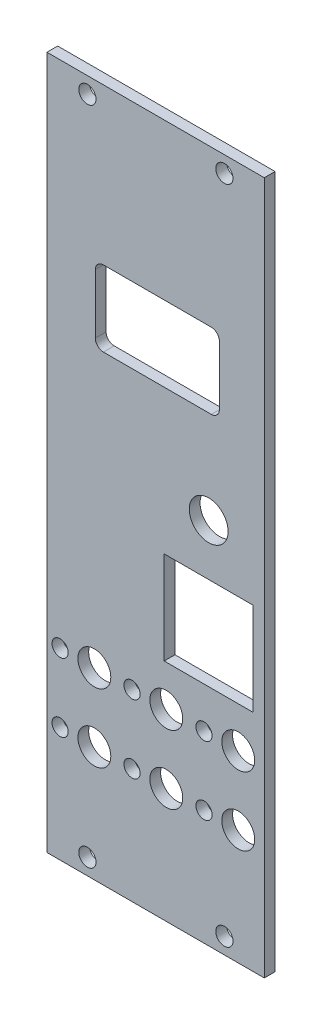
ISO-10303-21;
HEADER;
FILE_DESCRIPTION(('STEP AP214'),'2;1');
FILE_NAME('part.step','',(''),(''),'','','');
FILE_SCHEMA(('AUTOMOTIVE_DESIGN { 1 0 10303 214 1 1 1 1 }'));
ENDSEC;
DATA;
#1=APPLICATION_CONTEXT('core data for automotive mechanical design processes');
#2=APPLICATION_PROTOCOL_DEFINITION('international standard','automotive_design',2000,#1);
#3=PRODUCT_CONTEXT('',#1,'mechanical');
#4=PRODUCT('Part','Part','',(#3));
#5=PRODUCT_RELATED_PRODUCT_CATEGORY('part','',(#4));
#6=PRODUCT_DEFINITION_FORMATION('','',#4);
#7=PRODUCT_DEFINITION_CONTEXT('part definition',#1,'design');
#8=PRODUCT_DEFINITION('design','',#6,#7);
#9=PRODUCT_DEFINITION_SHAPE('','',#8);
#10=(LENGTH_UNIT() NAMED_UNIT(*) SI_UNIT(.MILLI.,.METRE.));
#11=(NAMED_UNIT(*) PLANE_ANGLE_UNIT() SI_UNIT($,.RADIAN.));
#12=(NAMED_UNIT(*) SI_UNIT($,.STERADIAN.) SOLID_ANGLE_UNIT());
#13=UNCERTAINTY_MEASURE_WITH_UNIT(LENGTH_MEASURE(1.E-05),#10,'distance_accuracy_value','');
#14=(GEOMETRIC_REPRESENTATION_CONTEXT(3) GLOBAL_UNCERTAINTY_ASSIGNED_CONTEXT((#13)) GLOBAL_UNIT_ASSIGNED_CONTEXT((#10,
#11,#12)) REPRESENTATION_CONTEXT('',''));
#15=CARTESIAN_POINT('',(0.,0.,0.));
#16=DIRECTION('',(0.,0.,1.));
#17=DIRECTION('',(1.,0.,0.));
#18=AXIS2_PLACEMENT_3D('',#15,#16,#17);
#19=CARTESIAN_POINT('',(0.,0.,2.));
#20=DIRECTION('',(0.,0.,-1.));
#21=DIRECTION('',(-1.,0.,0.));
#22=AXIS2_PLACEMENT_3D('',#19,#20,#21);
#23=PLANE('',#22);
#24=DIRECTION('',(0.,-1.,0.));
#25=VECTOR('',#24,1.);
#26=CARTESIAN_POINT('',(21.74,58.82,2.));
#27=LINE('',#26,#25);
#28=CARTESIAN_POINT('',(21.74,58.82,2.));
#29=VERTEX_POINT('',#28);
#30=CARTESIAN_POINT('',(21.74,41.62,2.));
#31=VERTEX_POINT('',#30);
#32=EDGE_CURVE('E210',#29,#31,#27,.T.);
#33=ORIENTED_EDGE('',*,*,#32,.F.);
#34=DIRECTION('',(-1.,0.,0.));
#35=VECTOR('',#34,1.);
#36=CARTESIAN_POINT('',(21.74,58.82,2.));
#37=LINE('',#36,#35);
#38=CARTESIAN_POINT('',(38.24,58.82,2.));
#39=VERTEX_POINT('',#38);
#40=EDGE_CURVE('E218',#39,#29,#37,.T.);
#41=ORIENTED_EDGE('',*,*,#40,.F.);
#42=DIRECTION('',(0.,1.,0.));
#43=VECTOR('',#42,1.);
#44=CARTESIAN_POINT('',(38.24,58.82,2.));
#45=LINE('',#44,#43);
#46=CARTESIAN_POINT('',(38.24,41.62,2.));
#47=VERTEX_POINT('',#46);
#48=EDGE_CURVE('E215',#47,#39,#45,.T.);
#49=ORIENTED_EDGE('',*,*,#48,.F.);
#50=DIRECTION('',(1.,0.,0.));
#51=VECTOR('',#50,1.);
#52=CARTESIAN_POINT('',(21.74,41.62,2.));
#53=LINE('',#52,#51);
#54=EDGE_CURVE('E212',#31,#47,#53,.T.);
#55=ORIENTED_EDGE('',*,*,#54,.F.);
#56=EDGE_LOOP('',(#33,#41,#49,#55));
#57=FACE_BOUND('',#56,.T.);
#58=DIRECTION('',(0.,-1.,0.));
#59=VECTOR('',#58,1.);
#60=CARTESIAN_POINT('',(0.,0.,2.));
#61=LINE('',#60,#59);
#62=CARTESIAN_POINT('',(0.,128.5,2.));
#63=VERTEX_POINT('',#62);
#64=CARTESIAN_POINT('',(0.,0.,2.));
#65=VERTEX_POINT('',#64);
#66=EDGE_CURVE('E343',#63,#65,#61,.T.);
#67=ORIENTED_EDGE('',*,*,#66,.T.);
#68=DIRECTION('',(1.,0.,0.));
#69=VECTOR('',#68,1.);
#70=CARTESIAN_POINT('',(0.,0.,2.));
#71=LINE('',#70,#69);
#72=CARTESIAN_POINT('',(40.3,0.,2.));
#73=VERTEX_POINT('',#72);
#74=EDGE_CURVE('E346',#65,#73,#71,.T.);
#75=ORIENTED_EDGE('',*,*,#74,.T.);
#76=DIRECTION('',(0.,1.,0.));
#77=VECTOR('',#76,1.);
#78=CARTESIAN_POINT('',(40.3,0.,2.));
#79=LINE('',#78,#77);
#80=CARTESIAN_POINT('',(40.3,128.5,2.));
#81=VERTEX_POINT('',#80);
#82=EDGE_CURVE('E349',#73,#81,#79,.T.);
#83=ORIENTED_EDGE('',*,*,#82,.T.);
#84=DIRECTION('',(-1.,0.,0.));
#85=VECTOR('',#84,1.);
#86=CARTESIAN_POINT('',(0.,128.5,2.));
#87=LINE('',#86,#85);
#88=EDGE_CURVE('E351',#81,#63,#87,.T.);
#89=ORIENTED_EDGE('',*,*,#88,.T.);
#90=EDGE_LOOP('',(#67,#75,#83,#89));
#91=FACE_BOUND('',#90,.T.);
#92=CARTESIAN_POINT('',(7.5,125.5,2.));
#93=DIRECTION('',(0.,0.,1.));
#94=DIRECTION('',(1.,0.,0.));
#95=AXIS2_PLACEMENT_3D('',#92,#93,#94);
#96=CIRCLE('',#95,1.59999999999999);
#97=CARTESIAN_POINT('',(9.09999999999999,125.5,2.));
#98=VERTEX_POINT('',#97);
#99=EDGE_CURVE('E337',#98,#98,#96,.T.);
#100=ORIENTED_EDGE('',*,*,#99,.F.);
#101=EDGE_LOOP('',(#100));
#102=FACE_BOUND('',#101,.T.);
#103=CARTESIAN_POINT('',(32.9,125.5,2.));
#104=DIRECTION('',(0.,0.,1.));
#105=DIRECTION('',(1.,0.,0.));
#106=AXIS2_PLACEMENT_3D('',#103,#104,#105);
#107=CIRCLE('',#106,1.6);
#108=CARTESIAN_POINT('',(34.5,125.5,2.));
#109=VERTEX_POINT('',#108);
#110=EDGE_CURVE('E331',#109,#109,#107,.T.);
#111=ORIENTED_EDGE('',*,*,#110,.F.);
#112=EDGE_LOOP('',(#111));
#113=FACE_BOUND('',#112,.T.);
#114=CARTESIAN_POINT('',(7.5,3.,2.));
#115=DIRECTION('',(0.,0.,1.));
#116=DIRECTION('',(1.,0.,0.));
#117=AXIS2_PLACEMENT_3D('',#114,#115,#116);
#118=CIRCLE('',#117,1.6);
#119=CARTESIAN_POINT('',(9.1,3.,2.));
#120=VERTEX_POINT('',#119);
#121=EDGE_CURVE('E325',#120,#120,#118,.T.);
#122=ORIENTED_EDGE('',*,*,#121,.F.);
#123=EDGE_LOOP('',(#122));
#124=FACE_BOUND('',#123,.T.);
#125=CARTESIAN_POINT('',(32.9,3.,2.));
#126=DIRECTION('',(0.,0.,1.));
#127=DIRECTION('',(1.,0.,0.));
#128=AXIS2_PLACEMENT_3D('',#125,#126,#127);
#129=CIRCLE('',#128,1.6);
#130=CARTESIAN_POINT('',(34.5,3.,2.));
#131=VERTEX_POINT('',#130);
#132=EDGE_CURVE('E319',#131,#131,#129,.T.);
#133=ORIENTED_EDGE('',*,*,#132,.F.);
#134=EDGE_LOOP('',(#133));
#135=FACE_BOUND('',#134,.T.);
#136=CARTESIAN_POINT('',(8.78999999999998,34.05,2.));
#137=DIRECTION('',(0.,0.,1.));
#138=DIRECTION('',(1.,0.,0.));
#139=AXIS2_PLACEMENT_3D('',#136,#137,#138);
#140=CIRCLE('',#139,3.05);
#141=CARTESIAN_POINT('',(11.84,34.05,2.));
#142=VERTEX_POINT('',#141);
#143=EDGE_CURVE('E313',#142,#142,#140,.T.);
#144=ORIENTED_EDGE('',*,*,#143,.F.);
#145=EDGE_LOOP('',(#144));
#146=FACE_BOUND('',#145,.T.);
#147=CARTESIAN_POINT('',(8.78999999999998,21.35,2.));
#148=DIRECTION('',(0.,0.,1.));
#149=DIRECTION('',(1.,0.,0.));
#150=AXIS2_PLACEMENT_3D('',#147,#148,#149);
#151=CIRCLE('',#150,3.05);
#152=CARTESIAN_POINT('',(11.84,21.35,2.));
#153=VERTEX_POINT('',#152);
#154=EDGE_CURVE('E307',#153,#153,#151,.T.);
#155=ORIENTED_EDGE('',*,*,#154,.F.);
#156=EDGE_LOOP('',(#155));
#157=FACE_BOUND('',#156,.T.);
#158=CARTESIAN_POINT('',(22.13,34.05,2.));
#159=DIRECTION('',(0.,0.,1.));
#160=DIRECTION('',(1.,0.,0.));
#161=AXIS2_PLACEMENT_3D('',#158,#159,#160);
#162=CIRCLE('',#161,3.05);
#163=CARTESIAN_POINT('',(25.18,34.05,2.));
#164=VERTEX_POINT('',#163);
#165=EDGE_CURVE('E301',#164,#164,#162,.T.);
#166=ORIENTED_EDGE('',*,*,#165,.F.);
#167=EDGE_LOOP('',(#166));
#168=FACE_BOUND('',#167,.T.);
#169=CARTESIAN_POINT('',(22.13,21.35,2.));
#170=DIRECTION('',(0.,0.,1.));
#171=DIRECTION('',(1.,0.,0.));
#172=AXIS2_PLACEMENT_3D('',#169,#170,#171);
#173=CIRCLE('',#172,3.05);
#174=CARTESIAN_POINT('',(25.18,21.35,2.));
#175=VERTEX_POINT('',#174);
#176=EDGE_CURVE('E295',#175,#175,#173,.T.);
#177=ORIENTED_EDGE('',*,*,#176,.F.);
#178=EDGE_LOOP('',(#177));
#179=FACE_BOUND('',#178,.T.);
#180=CARTESIAN_POINT('',(35.47,21.35,2.));
#181=DIRECTION('',(0.,0.,1.));
#182=DIRECTION('',(1.,0.,0.));
#183=AXIS2_PLACEMENT_3D('',#180,#181,#182);
#184=CIRCLE('',#183,3.05);
#185=CARTESIAN_POINT('',(38.52,21.35,2.));
#186=VERTEX_POINT('',#185);
#187=EDGE_CURVE('E289',#186,#186,#184,.T.);
#188=ORIENTED_EDGE('',*,*,#187,.F.);
#189=EDGE_LOOP('',(#188));
#190=FACE_BOUND('',#189,.T.);
#191=CARTESIAN_POINT('',(35.47,34.05,2.));
#192=DIRECTION('',(0.,0.,1.));
#193=DIRECTION('',(1.,0.,0.));
#194=AXIS2_PLACEMENT_3D('',#191,#192,#193);
#195=CIRCLE('',#194,3.05);
#196=CARTESIAN_POINT('',(38.52,34.05,2.));
#197=VERTEX_POINT('',#196);
#198=EDGE_CURVE('E283',#197,#197,#195,.T.);
#199=ORIENTED_EDGE('',*,*,#198,.F.);
#200=EDGE_LOOP('',(#199));
#201=FACE_BOUND('',#200,.T.);
#202=CARTESIAN_POINT('',(2.43999999999998,34.05,2.));
#203=DIRECTION('',(0.,0.,1.));
#204=DIRECTION('',(1.,0.,0.));
#205=AXIS2_PLACEMENT_3D('',#202,#203,#204);
#206=CIRCLE('',#205,1.5);
#207=CARTESIAN_POINT('',(3.93999999999998,34.05,2.));
#208=VERTEX_POINT('',#207);
#209=EDGE_CURVE('E277',#208,#208,#206,.T.);
#210=ORIENTED_EDGE('',*,*,#209,.F.);
#211=EDGE_LOOP('',(#210));
#212=FACE_BOUND('',#211,.T.);
#213=CARTESIAN_POINT('',(15.78,34.05,2.));
#214=DIRECTION('',(0.,0.,1.));
#215=DIRECTION('',(1.,0.,0.));
#216=AXIS2_PLACEMENT_3D('',#213,#214,#215);
#217=CIRCLE('',#216,1.5);
#218=CARTESIAN_POINT('',(17.28,34.05,2.));
#219=VERTEX_POINT('',#218);
#220=EDGE_CURVE('E271',#219,#219,#217,.T.);
#221=ORIENTED_EDGE('',*,*,#220,.F.);
#222=EDGE_LOOP('',(#221));
#223=FACE_BOUND('',#222,.T.);
#224=CARTESIAN_POINT('',(29.12,34.05,2.));
#225=DIRECTION('',(0.,0.,1.));
#226=DIRECTION('',(1.,0.,0.));
#227=AXIS2_PLACEMENT_3D('',#224,#225,#226);
#228=CIRCLE('',#227,1.5);
#229=CARTESIAN_POINT('',(30.62,34.05,2.));
#230=VERTEX_POINT('',#229);
#231=EDGE_CURVE('E265',#230,#230,#228,.T.);
#232=ORIENTED_EDGE('',*,*,#231,.F.);
#233=EDGE_LOOP('',(#232));
#234=FACE_BOUND('',#233,.T.);
#235=CARTESIAN_POINT('',(2.43999999999998,21.35,2.));
#236=DIRECTION('',(0.,0.,1.));
#237=DIRECTION('',(1.,0.,0.));
#238=AXIS2_PLACEMENT_3D('',#235,#236,#237);
#239=CIRCLE('',#238,1.5);
#240=CARTESIAN_POINT('',(3.93999999999998,21.35,2.));
#241=VERTEX_POINT('',#240);
#242=EDGE_CURVE('E259',#241,#241,#239,.T.);
#243=ORIENTED_EDGE('',*,*,#242,.F.);
#244=EDGE_LOOP('',(#243));
#245=FACE_BOUND('',#244,.T.);
#246=CARTESIAN_POINT('',(15.78,21.35,2.));
#247=DIRECTION('',(0.,0.,1.));
#248=DIRECTION('',(1.,0.,0.));
#249=AXIS2_PLACEMENT_3D('',#246,#247,#248);
#250=CIRCLE('',#249,1.5);
#251=CARTESIAN_POINT('',(17.28,21.35,2.));
#252=VERTEX_POINT('',#251);
#253=EDGE_CURVE('E253',#252,#252,#250,.T.);
#254=ORIENTED_EDGE('',*,*,#253,.F.);
#255=EDGE_LOOP('',(#254));
#256=FACE_BOUND('',#255,.T.);
#257=CARTESIAN_POINT('',(29.12,21.35,2.));
#258=DIRECTION('',(0.,0.,1.));
#259=DIRECTION('',(1.,0.,0.));
#260=AXIS2_PLACEMENT_3D('',#257,#258,#259);
#261=CIRCLE('',#260,1.5);
#262=CARTESIAN_POINT('',(30.62,21.35,2.));
#263=VERTEX_POINT('',#262);
#264=EDGE_CURVE('E247',#263,#263,#261,.T.);
#265=ORIENTED_EDGE('',*,*,#264,.F.);
#266=EDGE_LOOP('',(#265));
#267=FACE_BOUND('',#266,.T.);
#268=CARTESIAN_POINT('',(29.99,68.34,2.));
#269=DIRECTION('',(0.,0.,1.));
#270=DIRECTION('',(1.,0.,0.));
#271=AXIS2_PLACEMENT_3D('',#268,#269,#270);
#272=CIRCLE('',#271,3.6);
#273=CARTESIAN_POINT('',(33.59,68.34,2.));
#274=VERTEX_POINT('',#273);
#275=EDGE_CURVE('E241',#274,#274,#272,.T.);
#276=ORIENTED_EDGE('',*,*,#275,.F.);
#277=EDGE_LOOP('',(#276));
#278=FACE_BOUND('',#277,.T.);
#279=CARTESIAN_POINT('',(10.47,87.09,2.));
#280=DIRECTION('',(0.,0.,1.));
#281=DIRECTION('',(1.,0.,0.));
#282=AXIS2_PLACEMENT_3D('',#279,#280,#281);
#283=CIRCLE('',#282,1.5);
#284=CARTESIAN_POINT('',(8.96999999999998,87.09,2.));
#285=VERTEX_POINT('',#284);
#286=CARTESIAN_POINT('',(10.47,85.59,2.));
#287=VERTEX_POINT('',#286);
#288=EDGE_CURVE('E145',#285,#287,#283,.T.);
#289=ORIENTED_EDGE('',*,*,#288,.F.);
#290=DIRECTION('',(0.,-1.,0.));
#291=VECTOR('',#290,1.);
#292=CARTESIAN_POINT('',(8.96999999999998,98.09,2.));
#293=LINE('',#292,#291);
#294=CARTESIAN_POINT('',(8.96999999999998,98.09,2.));
#295=VERTEX_POINT('',#294);
#296=EDGE_CURVE('E178',#295,#285,#293,.T.);
#297=ORIENTED_EDGE('',*,*,#296,.F.);
#298=CARTESIAN_POINT('',(10.47,98.09,2.));
#299=DIRECTION('',(0.,0.,1.));
#300=DIRECTION('',(1.,0.,0.));
#301=AXIS2_PLACEMENT_3D('',#298,#299,#300);
#302=CIRCLE('',#301,1.5);
#303=CARTESIAN_POINT('',(10.47,99.59,2.));
#304=VERTEX_POINT('',#303);
#305=EDGE_CURVE('E176',#304,#295,#302,.T.);
#306=ORIENTED_EDGE('',*,*,#305,.F.);
#307=DIRECTION('',(-1.,0.,0.));
#308=VECTOR('',#307,1.);
#309=CARTESIAN_POINT('',(10.47,99.59,2.));
#310=LINE('',#309,#308);
#311=CARTESIAN_POINT('',(30.47,99.59,2.));
#312=VERTEX_POINT('',#311);
#313=EDGE_CURVE('E174',#312,#304,#310,.T.);
#314=ORIENTED_EDGE('',*,*,#313,.F.);
#315=CARTESIAN_POINT('',(30.47,98.09,2.));
#316=DIRECTION('',(0.,0.,1.));
#317=DIRECTION('',(-1.,0.,0.));
#318=AXIS2_PLACEMENT_3D('',#315,#316,#317);
#319=CIRCLE('',#318,1.5);
#320=CARTESIAN_POINT('',(31.97,98.09,2.));
#321=VERTEX_POINT('',#320);
#322=EDGE_CURVE('E172',#321,#312,#319,.T.);
#323=ORIENTED_EDGE('',*,*,#322,.F.);
#324=DIRECTION('',(0.,1.,0.));
#325=VECTOR('',#324,1.);
#326=CARTESIAN_POINT('',(31.97,98.09,2.));
#327=LINE('',#326,#325);
#328=CARTESIAN_POINT('',(31.97,87.09,2.));
#329=VERTEX_POINT('',#328);
#330=EDGE_CURVE('E168',#329,#321,#327,.T.);
#331=ORIENTED_EDGE('',*,*,#330,.F.);
#332=CARTESIAN_POINT('',(30.47,87.09,2.));
#333=DIRECTION('',(0.,0.,1.));
#334=DIRECTION('',(1.,0.,0.));
#335=AXIS2_PLACEMENT_3D('',#332,#333,#334);
#336=CIRCLE('',#335,1.5);
#337=CARTESIAN_POINT('',(30.47,85.59,2.));
#338=VERTEX_POINT('',#337);
#339=EDGE_CURVE('E166',#338,#329,#336,.T.);
#340=ORIENTED_EDGE('',*,*,#339,.F.);
#341=DIRECTION('',(1.,0.,0.));
#342=VECTOR('',#341,1.);
#343=CARTESIAN_POINT('',(10.47,85.59,2.));
#344=LINE('',#343,#342);
#345=EDGE_CURVE('E153',#287,#338,#344,.T.);
#346=ORIENTED_EDGE('',*,*,#345,.F.);
#347=EDGE_LOOP('',(#289,#297,#306,#314,#323,#331,#340,#346));
#348=FACE_BOUND('',#347,.T.);
#349=ADVANCED_FACE('F32',(#57,#91,#102,#113,#124,#135,#146,#157,#168,#179,#190,#201,#212,#223,
#234,#245,#256,#267,#278,#348),#23,.F.);
#350=CARTESIAN_POINT('',(0.,0.,0.));
#351=DIRECTION('',(0.,0.,-1.));
#352=DIRECTION('',(-1.,0.,0.));
#353=AXIS2_PLACEMENT_3D('',#350,#351,#352);
#354=PLANE('',#353);
#355=CARTESIAN_POINT('',(29.12,21.35,0.));
#356=DIRECTION('',(0.,0.,1.));
#357=DIRECTION('',(1.,0.,0.));
#358=AXIS2_PLACEMENT_3D('',#355,#356,#357);
#359=CIRCLE('',#358,1.5);
#360=CARTESIAN_POINT('',(30.62,21.35,0.));
#361=VERTEX_POINT('',#360);
#362=EDGE_CURVE('E244',#361,#361,#359,.T.);
#363=ORIENTED_EDGE('',*,*,#362,.T.);
#364=EDGE_LOOP('',(#363));
#365=FACE_BOUND('',#364,.T.);
#366=CARTESIAN_POINT('',(2.43999999999998,21.35,0.));
#367=DIRECTION('',(0.,0.,1.));
#368=DIRECTION('',(1.,0.,0.));
#369=AXIS2_PLACEMENT_3D('',#366,#367,#368);
#370=CIRCLE('',#369,1.5);
#371=CARTESIAN_POINT('',(3.93999999999998,21.35,0.));
#372=VERTEX_POINT('',#371);
#373=EDGE_CURVE('E256',#372,#372,#370,.T.);
#374=ORIENTED_EDGE('',*,*,#373,.T.);
#375=EDGE_LOOP('',(#374));
#376=FACE_BOUND('',#375,.T.);
#377=CARTESIAN_POINT('',(15.78,34.05,0.));
#378=DIRECTION('',(0.,0.,1.));
#379=DIRECTION('',(1.,0.,0.));
#380=AXIS2_PLACEMENT_3D('',#377,#378,#379);
#381=CIRCLE('',#380,1.5);
#382=CARTESIAN_POINT('',(17.28,34.05,0.));
#383=VERTEX_POINT('',#382);
#384=EDGE_CURVE('E268',#383,#383,#381,.T.);
#385=ORIENTED_EDGE('',*,*,#384,.T.);
#386=EDGE_LOOP('',(#385));
#387=FACE_BOUND('',#386,.T.);
#388=CARTESIAN_POINT('',(35.47,34.05,0.));
#389=DIRECTION('',(0.,0.,1.));
#390=DIRECTION('',(1.,0.,0.));
#391=AXIS2_PLACEMENT_3D('',#388,#389,#390);
#392=CIRCLE('',#391,3.05);
#393=CARTESIAN_POINT('',(38.52,34.05,0.));
#394=VERTEX_POINT('',#393);
#395=EDGE_CURVE('E280',#394,#394,#392,.T.);
#396=ORIENTED_EDGE('',*,*,#395,.T.);
#397=EDGE_LOOP('',(#396));
#398=FACE_BOUND('',#397,.T.);
#399=CARTESIAN_POINT('',(22.13,21.35,0.));
#400=DIRECTION('',(0.,0.,1.));
#401=DIRECTION('',(1.,0.,0.));
#402=AXIS2_PLACEMENT_3D('',#399,#400,#401);
#403=CIRCLE('',#402,3.05);
#404=CARTESIAN_POINT('',(25.18,21.35,0.));
#405=VERTEX_POINT('',#404);
#406=EDGE_CURVE('E292',#405,#405,#403,.T.);
#407=ORIENTED_EDGE('',*,*,#406,.T.);
#408=EDGE_LOOP('',(#407));
#409=FACE_BOUND('',#408,.T.);
#410=CARTESIAN_POINT('',(8.78999999999998,21.35,0.));
#411=DIRECTION('',(0.,0.,1.));
#412=DIRECTION('',(1.,0.,0.));
#413=AXIS2_PLACEMENT_3D('',#410,#411,#412);
#414=CIRCLE('',#413,3.05);
#415=CARTESIAN_POINT('',(11.84,21.35,0.));
#416=VERTEX_POINT('',#415);
#417=EDGE_CURVE('E304',#416,#416,#414,.T.);
#418=ORIENTED_EDGE('',*,*,#417,.T.);
#419=EDGE_LOOP('',(#418));
#420=FACE_BOUND('',#419,.T.);
#421=CARTESIAN_POINT('',(32.9,3.,0.));
#422=DIRECTION('',(0.,0.,1.));
#423=DIRECTION('',(1.,0.,0.));
#424=AXIS2_PLACEMENT_3D('',#421,#422,#423);
#425=CIRCLE('',#424,1.6);
#426=CARTESIAN_POINT('',(34.5,3.,0.));
#427=VERTEX_POINT('',#426);
#428=EDGE_CURVE('E316',#427,#427,#425,.T.);
#429=ORIENTED_EDGE('',*,*,#428,.T.);
#430=EDGE_LOOP('',(#429));
#431=FACE_BOUND('',#430,.T.);
#432=CARTESIAN_POINT('',(32.9,125.5,0.));
#433=DIRECTION('',(0.,0.,1.));
#434=DIRECTION('',(1.,0.,0.));
#435=AXIS2_PLACEMENT_3D('',#432,#433,#434);
#436=CIRCLE('',#435,1.6);
#437=CARTESIAN_POINT('',(34.5,125.5,0.));
#438=VERTEX_POINT('',#437);
#439=EDGE_CURVE('E328',#438,#438,#436,.T.);
#440=ORIENTED_EDGE('',*,*,#439,.T.);
#441=EDGE_LOOP('',(#440));
#442=FACE_BOUND('',#441,.T.);
#443=DIRECTION('',(0.,-1.,0.));
#444=VECTOR('',#443,1.);
#445=CARTESIAN_POINT('',(0.,0.,0.));
#446=LINE('',#445,#444);
#447=CARTESIAN_POINT('',(0.,128.5,0.));
#448=VERTEX_POINT('',#447);
#449=CARTESIAN_POINT('',(0.,0.,0.));
#450=VERTEX_POINT('',#449);
#451=EDGE_CURVE('E340',#448,#450,#446,.T.);
#452=ORIENTED_EDGE('',*,*,#451,.F.);
#453=DIRECTION('',(-1.,0.,0.));
#454=VECTOR('',#453,1.);
#455=CARTESIAN_POINT('',(0.,128.5,0.));
#456=LINE('',#455,#454);
#457=CARTESIAN_POINT('',(40.3,128.5,0.));
#458=VERTEX_POINT('',#457);
#459=EDGE_CURVE('E347',#458,#448,#456,.T.);
#460=ORIENTED_EDGE('',*,*,#459,.F.);
#461=DIRECTION('',(0.,1.,0.));
#462=VECTOR('',#461,1.);
#463=CARTESIAN_POINT('',(40.3,0.,0.));
#464=LINE('',#463,#462);
#465=CARTESIAN_POINT('',(40.3,0.,0.));
#466=VERTEX_POINT('',#465);
#467=EDGE_CURVE('E358',#466,#458,#464,.T.);
#468=ORIENTED_EDGE('',*,*,#467,.F.);
#469=DIRECTION('',(1.,0.,0.));
#470=VECTOR('',#469,1.);
#471=CARTESIAN_POINT('',(0.,0.,0.));
#472=LINE('',#471,#470);
#473=EDGE_CURVE('E356',#450,#466,#472,.T.);
#474=ORIENTED_EDGE('',*,*,#473,.F.);
#475=EDGE_LOOP('',(#452,#460,#468,#474));
#476=FACE_BOUND('',#475,.T.);
#477=CARTESIAN_POINT('',(7.5,125.5,0.));
#478=DIRECTION('',(0.,0.,1.));
#479=DIRECTION('',(1.,0.,0.));
#480=AXIS2_PLACEMENT_3D('',#477,#478,#479);
#481=CIRCLE('',#480,1.59999999999999);
#482=CARTESIAN_POINT('',(9.09999999999999,125.5,0.));
#483=VERTEX_POINT('',#482);
#484=EDGE_CURVE('E334',#483,#483,#481,.T.);
#485=ORIENTED_EDGE('',*,*,#484,.T.);
#486=EDGE_LOOP('',(#485));
#487=FACE_BOUND('',#486,.T.);
#488=CARTESIAN_POINT('',(7.5,3.,0.));
#489=DIRECTION('',(0.,0.,1.));
#490=DIRECTION('',(1.,0.,0.));
#491=AXIS2_PLACEMENT_3D('',#488,#489,#490);
#492=CIRCLE('',#491,1.6);
#493=CARTESIAN_POINT('',(9.1,3.,0.));
#494=VERTEX_POINT('',#493);
#495=EDGE_CURVE('E322',#494,#494,#492,.T.);
#496=ORIENTED_EDGE('',*,*,#495,.T.);
#497=EDGE_LOOP('',(#496));
#498=FACE_BOUND('',#497,.T.);
#499=CARTESIAN_POINT('',(8.78999999999998,34.05,0.));
#500=DIRECTION('',(0.,0.,1.));
#501=DIRECTION('',(1.,0.,0.));
#502=AXIS2_PLACEMENT_3D('',#499,#500,#501);
#503=CIRCLE('',#502,3.05);
#504=CARTESIAN_POINT('',(11.84,34.05,0.));
#505=VERTEX_POINT('',#504);
#506=EDGE_CURVE('E310',#505,#505,#503,.T.);
#507=ORIENTED_EDGE('',*,*,#506,.T.);
#508=EDGE_LOOP('',(#507));
#509=FACE_BOUND('',#508,.T.);
#510=CARTESIAN_POINT('',(22.13,34.05,0.));
#511=DIRECTION('',(0.,0.,1.));
#512=DIRECTION('',(1.,0.,0.));
#513=AXIS2_PLACEMENT_3D('',#510,#511,#512);
#514=CIRCLE('',#513,3.05);
#515=CARTESIAN_POINT('',(25.18,34.05,0.));
#516=VERTEX_POINT('',#515);
#517=EDGE_CURVE('E298',#516,#516,#514,.T.);
#518=ORIENTED_EDGE('',*,*,#517,.T.);
#519=EDGE_LOOP('',(#518));
#520=FACE_BOUND('',#519,.T.);
#521=CARTESIAN_POINT('',(35.47,21.35,0.));
#522=DIRECTION('',(0.,0.,1.));
#523=DIRECTION('',(1.,0.,0.));
#524=AXIS2_PLACEMENT_3D('',#521,#522,#523);
#525=CIRCLE('',#524,3.05);
#526=CARTESIAN_POINT('',(38.52,21.35,0.));
#527=VERTEX_POINT('',#526);
#528=EDGE_CURVE('E286',#527,#527,#525,.T.);
#529=ORIENTED_EDGE('',*,*,#528,.T.);
#530=EDGE_LOOP('',(#529));
#531=FACE_BOUND('',#530,.T.);
#532=CARTESIAN_POINT('',(2.43999999999998,34.05,0.));
#533=DIRECTION('',(0.,0.,1.));
#534=DIRECTION('',(1.,0.,0.));
#535=AXIS2_PLACEMENT_3D('',#532,#533,#534);
#536=CIRCLE('',#535,1.5);
#537=CARTESIAN_POINT('',(3.93999999999998,34.05,0.));
#538=VERTEX_POINT('',#537);
#539=EDGE_CURVE('E274',#538,#538,#536,.T.);
#540=ORIENTED_EDGE('',*,*,#539,.T.);
#541=EDGE_LOOP('',(#540));
#542=FACE_BOUND('',#541,.T.);
#543=CARTESIAN_POINT('',(29.12,34.05,0.));
#544=DIRECTION('',(0.,0.,1.));
#545=DIRECTION('',(1.,0.,0.));
#546=AXIS2_PLACEMENT_3D('',#543,#544,#545);
#547=CIRCLE('',#546,1.5);
#548=CARTESIAN_POINT('',(30.62,34.05,0.));
#549=VERTEX_POINT('',#548);
#550=EDGE_CURVE('E262',#549,#549,#547,.T.);
#551=ORIENTED_EDGE('',*,*,#550,.T.);
#552=EDGE_LOOP('',(#551));
#553=FACE_BOUND('',#552,.T.);
#554=CARTESIAN_POINT('',(15.78,21.35,0.));
#555=DIRECTION('',(0.,0.,1.));
#556=DIRECTION('',(1.,0.,0.));
#557=AXIS2_PLACEMENT_3D('',#554,#555,#556);
#558=CIRCLE('',#557,1.5);
#559=CARTESIAN_POINT('',(17.28,21.35,0.));
#560=VERTEX_POINT('',#559);
#561=EDGE_CURVE('E250',#560,#560,#558,.T.);
#562=ORIENTED_EDGE('',*,*,#561,.T.);
#563=EDGE_LOOP('',(#562));
#564=FACE_BOUND('',#563,.T.);
#565=CARTESIAN_POINT('',(29.99,68.34,0.));
#566=DIRECTION('',(0.,0.,1.));
#567=DIRECTION('',(1.,0.,0.));
#568=AXIS2_PLACEMENT_3D('',#565,#566,#567);
#569=CIRCLE('',#568,3.6);
#570=CARTESIAN_POINT('',(33.59,68.34,0.));
#571=VERTEX_POINT('',#570);
#572=EDGE_CURVE('E240',#571,#571,#569,.T.);
#573=ORIENTED_EDGE('',*,*,#572,.T.);
#574=EDGE_LOOP('',(#573));
#575=FACE_BOUND('',#574,.T.);
#576=DIRECTION('',(-1.,0.,0.));
#577=VECTOR('',#576,1.);
#578=CARTESIAN_POINT('',(21.74,58.82,0.));
#579=LINE('',#578,#577);
#580=CARTESIAN_POINT('',(38.24,58.82,0.));
#581=VERTEX_POINT('',#580);
#582=CARTESIAN_POINT('',(21.74,58.82,0.));
#583=VERTEX_POINT('',#582);
#584=EDGE_CURVE('E213',#581,#583,#579,.T.);
#585=ORIENTED_EDGE('',*,*,#584,.T.);
#586=DIRECTION('',(0.,-1.,0.));
#587=VECTOR('',#586,1.);
#588=CARTESIAN_POINT('',(21.74,58.82,0.));
#589=LINE('',#588,#587);
#590=CARTESIAN_POINT('',(21.74,41.62,0.));
#591=VERTEX_POINT('',#590);
#592=EDGE_CURVE('E161',#583,#591,#589,.T.);
#593=ORIENTED_EDGE('',*,*,#592,.T.);
#594=DIRECTION('',(1.,0.,0.));
#595=VECTOR('',#594,1.);
#596=CARTESIAN_POINT('',(21.74,41.62,0.));
#597=LINE('',#596,#595);
#598=CARTESIAN_POINT('',(38.24,41.62,0.));
#599=VERTEX_POINT('',#598);
#600=EDGE_CURVE('E223',#591,#599,#597,.T.);
#601=ORIENTED_EDGE('',*,*,#600,.T.);
#602=DIRECTION('',(0.,1.,0.));
#603=VECTOR('',#602,1.);
#604=CARTESIAN_POINT('',(38.24,58.82,0.));
#605=LINE('',#604,#603);
#606=EDGE_CURVE('E226',#599,#581,#605,.T.);
#607=ORIENTED_EDGE('',*,*,#606,.T.);
#608=EDGE_LOOP('',(#585,#593,#601,#607));
#609=FACE_BOUND('',#608,.T.);
#610=DIRECTION('',(0.,-1.,0.));
#611=VECTOR('',#610,1.);
#612=CARTESIAN_POINT('',(8.96999999999998,98.09,0.));
#613=LINE('',#612,#611);
#614=CARTESIAN_POINT('',(8.96999999999998,98.09,0.));
#615=VERTEX_POINT('',#614);
#616=CARTESIAN_POINT('',(8.96999999999998,87.09,0.));
#617=VERTEX_POINT('',#616);
#618=EDGE_CURVE('E154',#615,#617,#613,.T.);
#619=ORIENTED_EDGE('',*,*,#618,.T.);
#620=CARTESIAN_POINT('',(10.47,87.09,0.));
#621=DIRECTION('',(0.,0.,1.));
#622=DIRECTION('',(1.,0.,0.));
#623=AXIS2_PLACEMENT_3D('',#620,#621,#622);
#624=CIRCLE('',#623,1.5);
#625=CARTESIAN_POINT('',(10.47,85.59,0.));
#626=VERTEX_POINT('',#625);
#627=EDGE_CURVE('E55',#617,#626,#624,.T.);
#628=ORIENTED_EDGE('',*,*,#627,.T.);
#629=DIRECTION('',(1.,0.,0.));
#630=VECTOR('',#629,1.);
#631=CARTESIAN_POINT('',(10.47,85.59,0.));
#632=LINE('',#631,#630);
#633=CARTESIAN_POINT('',(30.47,85.59,0.));
#634=VERTEX_POINT('',#633);
#635=EDGE_CURVE('E160',#626,#634,#632,.T.);
#636=ORIENTED_EDGE('',*,*,#635,.T.);
#637=CARTESIAN_POINT('',(30.47,87.09,0.));
#638=DIRECTION('',(0.,0.,1.));
#639=DIRECTION('',(1.,0.,0.));
#640=AXIS2_PLACEMENT_3D('',#637,#638,#639);
#641=CIRCLE('',#640,1.5);
#642=CARTESIAN_POINT('',(31.97,87.09,0.));
#643=VERTEX_POINT('',#642);
#644=EDGE_CURVE('E182',#634,#643,#641,.T.);
#645=ORIENTED_EDGE('',*,*,#644,.T.);
#646=DIRECTION('',(0.,1.,0.));
#647=VECTOR('',#646,1.);
#648=CARTESIAN_POINT('',(31.97,98.09,0.));
#649=LINE('',#648,#647);
#650=CARTESIAN_POINT('',(31.97,98.09,0.));
#651=VERTEX_POINT('',#650);
#652=EDGE_CURVE('E185',#643,#651,#649,.T.);
#653=ORIENTED_EDGE('',*,*,#652,.T.);
#654=CARTESIAN_POINT('',(30.47,98.09,0.));
#655=DIRECTION('',(0.,0.,1.));
#656=DIRECTION('',(-1.,0.,0.));
#657=AXIS2_PLACEMENT_3D('',#654,#655,#656);
#658=CIRCLE('',#657,1.5);
#659=CARTESIAN_POINT('',(30.47,99.59,0.));
#660=VERTEX_POINT('',#659);
#661=EDGE_CURVE('E188',#651,#660,#658,.T.);
#662=ORIENTED_EDGE('',*,*,#661,.T.);
#663=DIRECTION('',(-1.,0.,0.));
#664=VECTOR('',#663,1.);
#665=CARTESIAN_POINT('',(10.47,99.59,0.));
#666=LINE('',#665,#664);
#667=CARTESIAN_POINT('',(10.47,99.59,0.));
#668=VERTEX_POINT('',#667);
#669=EDGE_CURVE('E191',#660,#668,#666,.T.);
#670=ORIENTED_EDGE('',*,*,#669,.T.);
#671=CARTESIAN_POINT('',(10.47,98.09,0.));
#672=DIRECTION('',(0.,0.,1.));
#673=DIRECTION('',(1.,0.,0.));
#674=AXIS2_PLACEMENT_3D('',#671,#672,#673);
#675=CIRCLE('',#674,1.5);
#676=EDGE_CURVE('E194',#668,#615,#675,.T.);
#677=ORIENTED_EDGE('',*,*,#676,.T.);
#678=EDGE_LOOP('',(#619,#628,#636,#645,#653,#662,#670,#677));
#679=FACE_BOUND('',#678,.T.);
#680=ADVANCED_FACE('F376',(#365,#376,#387,#398,#409,#420,#431,#442,#476,#487,#498,#509,#520,
#531,#542,#553,#564,#575,#609,#679),#354,.T.);
#681=CARTESIAN_POINT('',(0.,0.,2.));
#682=DIRECTION('',(1.,0.,0.));
#683=DIRECTION('',(0.,1.,0.));
#684=AXIS2_PLACEMENT_3D('',#681,#682,#683);
#685=PLANE('',#684);
#686=ORIENTED_EDGE('',*,*,#451,.T.);
#687=DIRECTION('',(0.,0.,-1.));
#688=VECTOR('',#687,1.);
#689=CARTESIAN_POINT('',(0.,0.,2.));
#690=LINE('',#689,#688);
#691=EDGE_CURVE('E11',#65,#450,#690,.T.);
#692=ORIENTED_EDGE('',*,*,#691,.F.);
#693=ORIENTED_EDGE('',*,*,#66,.F.);
#694=DIRECTION('',(0.,0.,-1.));
#695=VECTOR('',#694,1.);
#696=CARTESIAN_POINT('',(0.,128.5,2.));
#697=LINE('',#696,#695);
#698=EDGE_CURVE('E353',#63,#448,#697,.T.);
#699=ORIENTED_EDGE('',*,*,#698,.T.);
#700=EDGE_LOOP('',(#686,#692,#693,#699));
#701=FACE_BOUND('',#700,.T.);
#702=ADVANCED_FACE('F34',(#701),#685,.F.);
#703=CARTESIAN_POINT('',(0.,0.,2.));
#704=DIRECTION('',(0.,1.,0.));
#705=DIRECTION('',(0.,0.,1.));
#706=AXIS2_PLACEMENT_3D('',#703,#704,#705);
#707=PLANE('',#706);
#708=ORIENTED_EDGE('',*,*,#473,.T.);
#709=DIRECTION('',(0.,0.,-1.));
#710=VECTOR('',#709,1.);
#711=CARTESIAN_POINT('',(40.3,0.,2.));
#712=LINE('',#711,#710);
#713=EDGE_CURVE('E40',#73,#466,#712,.T.);
#714=ORIENTED_EDGE('',*,*,#713,.F.);
#715=ORIENTED_EDGE('',*,*,#74,.F.);
#716=ORIENTED_EDGE('',*,*,#691,.T.);
#717=EDGE_LOOP('',(#708,#714,#715,#716));
#718=FACE_BOUND('',#717,.T.);
#719=ADVANCED_FACE('F387',(#718),#707,.F.);
#720=CARTESIAN_POINT('',(40.3,0.,2.));
#721=DIRECTION('',(-1.,0.,0.));
#722=DIRECTION('',(0.,-1.,0.));
#723=AXIS2_PLACEMENT_3D('',#720,#721,#722);
#724=PLANE('',#723);
#725=ORIENTED_EDGE('',*,*,#467,.T.);
#726=DIRECTION('',(0.,0.,-1.));
#727=VECTOR('',#726,1.);
#728=CARTESIAN_POINT('',(40.3,128.5,2.));
#729=LINE('',#728,#727);
#730=EDGE_CURVE('E363',#81,#458,#729,.T.);
#731=ORIENTED_EDGE('',*,*,#730,.F.);
#732=ORIENTED_EDGE('',*,*,#82,.F.);
#733=ORIENTED_EDGE('',*,*,#713,.T.);
#734=EDGE_LOOP('',(#725,#731,#732,#733));
#735=FACE_BOUND('',#734,.T.);
#736=ADVANCED_FACE('F370',(#735),#724,.F.);
#737=CARTESIAN_POINT('',(0.,128.5,2.));
#738=DIRECTION('',(0.,-1.,0.));
#739=DIRECTION('',(1.,0.,0.));
#740=AXIS2_PLACEMENT_3D('',#737,#738,#739);
#741=PLANE('',#740);
#742=ORIENTED_EDGE('',*,*,#459,.T.);
#743=ORIENTED_EDGE('',*,*,#698,.F.);
#744=ORIENTED_EDGE('',*,*,#88,.F.);
#745=ORIENTED_EDGE('',*,*,#730,.T.);
#746=EDGE_LOOP('',(#742,#743,#744,#745));
#747=FACE_BOUND('',#746,.T.);
#748=ADVANCED_FACE('F380',(#747),#741,.F.);
#749=CARTESIAN_POINT('',(7.5,125.5,2.));
#750=DIRECTION('',(0.,0.,-1.));
#751=DIRECTION('',(-1.,0.,0.));
#752=AXIS2_PLACEMENT_3D('',#749,#750,#751);
#753=CYLINDRICAL_SURFACE('',#752,1.59999999999999);
#754=ORIENTED_EDGE('',*,*,#99,.T.);
#755=EDGE_LOOP('',(#754));
#756=FACE_BOUND('',#755,.T.);
#757=ORIENTED_EDGE('',*,*,#484,.F.);
#758=EDGE_LOOP('',(#757));
#759=FACE_BOUND('',#758,.T.);
#760=ADVANCED_FACE('F404',(#756,#759),#753,.F.);
#761=CARTESIAN_POINT('',(32.9,125.5,2.));
#762=DIRECTION('',(0.,0.,-1.));
#763=DIRECTION('',(-1.,0.,0.));
#764=AXIS2_PLACEMENT_3D('',#761,#762,#763);
#765=CYLINDRICAL_SURFACE('',#764,1.6);
#766=ORIENTED_EDGE('',*,*,#110,.T.);
#767=EDGE_LOOP('',(#766));
#768=FACE_BOUND('',#767,.T.);
#769=ORIENTED_EDGE('',*,*,#439,.F.);
#770=EDGE_LOOP('',(#769));
#771=FACE_BOUND('',#770,.T.);
#772=ADVANCED_FACE('F411',(#768,#771),#765,.F.);
#773=CARTESIAN_POINT('',(7.5,3.,2.));
#774=DIRECTION('',(0.,0.,-1.));
#775=DIRECTION('',(-1.,0.,0.));
#776=AXIS2_PLACEMENT_3D('',#773,#774,#775);
#777=CYLINDRICAL_SURFACE('',#776,1.6);
#778=ORIENTED_EDGE('',*,*,#121,.T.);
#779=EDGE_LOOP('',(#778));
#780=FACE_BOUND('',#779,.T.);
#781=ORIENTED_EDGE('',*,*,#495,.F.);
#782=EDGE_LOOP('',(#781));
#783=FACE_BOUND('',#782,.T.);
#784=ADVANCED_FACE('F416',(#780,#783),#777,.F.);
#785=CARTESIAN_POINT('',(32.9,3.,2.));
#786=DIRECTION('',(0.,0.,-1.));
#787=DIRECTION('',(-1.,0.,0.));
#788=AXIS2_PLACEMENT_3D('',#785,#786,#787);
#789=CYLINDRICAL_SURFACE('',#788,1.6);
#790=ORIENTED_EDGE('',*,*,#132,.T.);
#791=EDGE_LOOP('',(#790));
#792=FACE_BOUND('',#791,.T.);
#793=ORIENTED_EDGE('',*,*,#428,.F.);
#794=EDGE_LOOP('',(#793));
#795=FACE_BOUND('',#794,.T.);
#796=ADVANCED_FACE('F542',(#792,#795),#789,.F.);
#797=CARTESIAN_POINT('',(8.78999999999998,34.05,2.));
#798=DIRECTION('',(0.,0.,-1.));
#799=DIRECTION('',(-1.,0.,0.));
#800=AXIS2_PLACEMENT_3D('',#797,#798,#799);
#801=CYLINDRICAL_SURFACE('',#800,3.05);
#802=ORIENTED_EDGE('',*,*,#143,.T.);
#803=EDGE_LOOP('',(#802));
#804=FACE_BOUND('',#803,.T.);
#805=ORIENTED_EDGE('',*,*,#506,.F.);
#806=EDGE_LOOP('',(#805));
#807=FACE_BOUND('',#806,.T.);
#808=ADVANCED_FACE('F538',(#804,#807),#801,.F.);
#809=CARTESIAN_POINT('',(8.78999999999998,21.35,2.));
#810=DIRECTION('',(0.,0.,-1.));
#811=DIRECTION('',(-1.,0.,0.));
#812=AXIS2_PLACEMENT_3D('',#809,#810,#811);
#813=CYLINDRICAL_SURFACE('',#812,3.05);
#814=ORIENTED_EDGE('',*,*,#154,.T.);
#815=EDGE_LOOP('',(#814));
#816=FACE_BOUND('',#815,.T.);
#817=ORIENTED_EDGE('',*,*,#417,.F.);
#818=EDGE_LOOP('',(#817));
#819=FACE_BOUND('',#818,.T.);
#820=ADVANCED_FACE('F534',(#816,#819),#813,.F.);
#821=CARTESIAN_POINT('',(22.13,34.05,2.));
#822=DIRECTION('',(0.,0.,-1.));
#823=DIRECTION('',(-1.,0.,0.));
#824=AXIS2_PLACEMENT_3D('',#821,#822,#823);
#825=CYLINDRICAL_SURFACE('',#824,3.05);
#826=ORIENTED_EDGE('',*,*,#165,.T.);
#827=EDGE_LOOP('',(#826));
#828=FACE_BOUND('',#827,.T.);
#829=ORIENTED_EDGE('',*,*,#517,.F.);
#830=EDGE_LOOP('',(#829));
#831=FACE_BOUND('',#830,.T.);
#832=ADVANCED_FACE('F530',(#828,#831),#825,.F.);
#833=CARTESIAN_POINT('',(22.13,21.35,2.));
#834=DIRECTION('',(0.,0.,-1.));
#835=DIRECTION('',(-1.,0.,0.));
#836=AXIS2_PLACEMENT_3D('',#833,#834,#835);
#837=CYLINDRICAL_SURFACE('',#836,3.05);
#838=ORIENTED_EDGE('',*,*,#176,.T.);
#839=EDGE_LOOP('',(#838));
#840=FACE_BOUND('',#839,.T.);
#841=ORIENTED_EDGE('',*,*,#406,.F.);
#842=EDGE_LOOP('',(#841));
#843=FACE_BOUND('',#842,.T.);
#844=ADVANCED_FACE('F526',(#840,#843),#837,.F.);
#845=CARTESIAN_POINT('',(35.47,21.35,2.));
#846=DIRECTION('',(0.,0.,-1.));
#847=DIRECTION('',(-1.,0.,0.));
#848=AXIS2_PLACEMENT_3D('',#845,#846,#847);
#849=CYLINDRICAL_SURFACE('',#848,3.05);
#850=ORIENTED_EDGE('',*,*,#187,.T.);
#851=EDGE_LOOP('',(#850));
#852=FACE_BOUND('',#851,.T.);
#853=ORIENTED_EDGE('',*,*,#528,.F.);
#854=EDGE_LOOP('',(#853));
#855=FACE_BOUND('',#854,.T.);
#856=ADVANCED_FACE('F522',(#852,#855),#849,.F.);
#857=CARTESIAN_POINT('',(35.47,34.05,2.));
#858=DIRECTION('',(0.,0.,-1.));
#859=DIRECTION('',(-1.,0.,0.));
#860=AXIS2_PLACEMENT_3D('',#857,#858,#859);
#861=CYLINDRICAL_SURFACE('',#860,3.05);
#862=ORIENTED_EDGE('',*,*,#198,.T.);
#863=EDGE_LOOP('',(#862));
#864=FACE_BOUND('',#863,.T.);
#865=ORIENTED_EDGE('',*,*,#395,.F.);
#866=EDGE_LOOP('',(#865));
#867=FACE_BOUND('',#866,.T.);
#868=ADVANCED_FACE('F518',(#864,#867),#861,.F.);
#869=CARTESIAN_POINT('',(2.43999999999998,34.05,2.));
#870=DIRECTION('',(0.,0.,-1.));
#871=DIRECTION('',(-1.,0.,0.));
#872=AXIS2_PLACEMENT_3D('',#869,#870,#871);
#873=CYLINDRICAL_SURFACE('',#872,1.5);
#874=ORIENTED_EDGE('',*,*,#209,.T.);
#875=EDGE_LOOP('',(#874));
#876=FACE_BOUND('',#875,.T.);
#877=ORIENTED_EDGE('',*,*,#539,.F.);
#878=EDGE_LOOP('',(#877));
#879=FACE_BOUND('',#878,.T.);
#880=ADVANCED_FACE('F514',(#876,#879),#873,.F.);
#881=CARTESIAN_POINT('',(15.78,34.05,2.));
#882=DIRECTION('',(0.,0.,-1.));
#883=DIRECTION('',(-1.,0.,0.));
#884=AXIS2_PLACEMENT_3D('',#881,#882,#883);
#885=CYLINDRICAL_SURFACE('',#884,1.5);
#886=ORIENTED_EDGE('',*,*,#220,.T.);
#887=EDGE_LOOP('',(#886));
#888=FACE_BOUND('',#887,.T.);
#889=ORIENTED_EDGE('',*,*,#384,.F.);
#890=EDGE_LOOP('',(#889));
#891=FACE_BOUND('',#890,.T.);
#892=ADVANCED_FACE('F510',(#888,#891),#885,.F.);
#893=CARTESIAN_POINT('',(29.12,34.05,2.));
#894=DIRECTION('',(0.,0.,-1.));
#895=DIRECTION('',(-1.,0.,0.));
#896=AXIS2_PLACEMENT_3D('',#893,#894,#895);
#897=CYLINDRICAL_SURFACE('',#896,1.5);
#898=ORIENTED_EDGE('',*,*,#231,.T.);
#899=EDGE_LOOP('',(#898));
#900=FACE_BOUND('',#899,.T.);
#901=ORIENTED_EDGE('',*,*,#550,.F.);
#902=EDGE_LOOP('',(#901));
#903=FACE_BOUND('',#902,.T.);
#904=ADVANCED_FACE('F506',(#900,#903),#897,.F.);
#905=CARTESIAN_POINT('',(2.43999999999998,21.35,2.));
#906=DIRECTION('',(0.,0.,-1.));
#907=DIRECTION('',(-1.,0.,0.));
#908=AXIS2_PLACEMENT_3D('',#905,#906,#907);
#909=CYLINDRICAL_SURFACE('',#908,1.5);
#910=ORIENTED_EDGE('',*,*,#242,.T.);
#911=EDGE_LOOP('',(#910));
#912=FACE_BOUND('',#911,.T.);
#913=ORIENTED_EDGE('',*,*,#373,.F.);
#914=EDGE_LOOP('',(#913));
#915=FACE_BOUND('',#914,.T.);
#916=ADVANCED_FACE('F502',(#912,#915),#909,.F.);
#917=CARTESIAN_POINT('',(15.78,21.35,2.));
#918=DIRECTION('',(0.,0.,-1.));
#919=DIRECTION('',(-1.,0.,0.));
#920=AXIS2_PLACEMENT_3D('',#917,#918,#919);
#921=CYLINDRICAL_SURFACE('',#920,1.5);
#922=ORIENTED_EDGE('',*,*,#253,.T.);
#923=EDGE_LOOP('',(#922));
#924=FACE_BOUND('',#923,.T.);
#925=ORIENTED_EDGE('',*,*,#561,.F.);
#926=EDGE_LOOP('',(#925));
#927=FACE_BOUND('',#926,.T.);
#928=ADVANCED_FACE('F498',(#924,#927),#921,.F.);
#929=CARTESIAN_POINT('',(29.12,21.35,2.));
#930=DIRECTION('',(0.,0.,-1.));
#931=DIRECTION('',(-1.,0.,0.));
#932=AXIS2_PLACEMENT_3D('',#929,#930,#931);
#933=CYLINDRICAL_SURFACE('',#932,1.5);
#934=ORIENTED_EDGE('',*,*,#264,.T.);
#935=EDGE_LOOP('',(#934));
#936=FACE_BOUND('',#935,.T.);
#937=ORIENTED_EDGE('',*,*,#362,.F.);
#938=EDGE_LOOP('',(#937));
#939=FACE_BOUND('',#938,.T.);
#940=ADVANCED_FACE('F494',(#936,#939),#933,.F.);
#941=CARTESIAN_POINT('',(29.99,68.34,2.));
#942=DIRECTION('',(0.,0.,-1.));
#943=DIRECTION('',(-1.,0.,0.));
#944=AXIS2_PLACEMENT_3D('',#941,#942,#943);
#945=CYLINDRICAL_SURFACE('',#944,3.6);
#946=ORIENTED_EDGE('',*,*,#275,.T.);
#947=EDGE_LOOP('',(#946));
#948=FACE_BOUND('',#947,.T.);
#949=ORIENTED_EDGE('',*,*,#572,.F.);
#950=EDGE_LOOP('',(#949));
#951=FACE_BOUND('',#950,.T.);
#952=ADVANCED_FACE('F490',(#948,#951),#945,.F.);
#953=CARTESIAN_POINT('',(21.74,58.82,2.));
#954=DIRECTION('',(1.,0.,0.));
#955=DIRECTION('',(0.,0.,-1.));
#956=AXIS2_PLACEMENT_3D('',#953,#954,#955);
#957=PLANE('',#956);
#958=ORIENTED_EDGE('',*,*,#592,.F.);
#959=DIRECTION('',(0.,0.,-1.));
#960=VECTOR('',#959,1.);
#961=CARTESIAN_POINT('',(21.74,58.82,2.));
#962=LINE('',#961,#960);
#963=EDGE_CURVE('E220',#29,#583,#962,.T.);
#964=ORIENTED_EDGE('',*,*,#963,.F.);
#965=ORIENTED_EDGE('',*,*,#32,.T.);
#966=DIRECTION('',(0.,0.,-1.));
#967=VECTOR('',#966,1.);
#968=CARTESIAN_POINT('',(21.74,41.62,2.));
#969=LINE('',#968,#967);
#970=EDGE_CURVE('E237',#31,#591,#969,.T.);
#971=ORIENTED_EDGE('',*,*,#970,.T.);
#972=EDGE_LOOP('',(#958,#964,#965,#971));
#973=FACE_BOUND('',#972,.T.);
#974=ADVANCED_FACE('F486',(#973),#957,.T.);
#975=CARTESIAN_POINT('',(21.74,41.62,2.));
#976=DIRECTION('',(0.,1.,0.));
#977=DIRECTION('',(0.,0.,1.));
#978=AXIS2_PLACEMENT_3D('',#975,#976,#977);
#979=PLANE('',#978);
#980=ORIENTED_EDGE('',*,*,#600,.F.);
#981=ORIENTED_EDGE('',*,*,#970,.F.);
#982=ORIENTED_EDGE('',*,*,#54,.T.);
#983=DIRECTION('',(0.,0.,-1.));
#984=VECTOR('',#983,1.);
#985=CARTESIAN_POINT('',(38.24,41.62,2.));
#986=LINE('',#985,#984);
#987=EDGE_CURVE('E235',#47,#599,#986,.T.);
#988=ORIENTED_EDGE('',*,*,#987,.T.);
#989=EDGE_LOOP('',(#980,#981,#982,#988));
#990=FACE_BOUND('',#989,.T.);
#991=ADVANCED_FACE('F482',(#990),#979,.T.);
#992=CARTESIAN_POINT('',(38.24,58.82,2.));
#993=DIRECTION('',(-1.,0.,0.));
#994=DIRECTION('',(0.,-1.,0.));
#995=AXIS2_PLACEMENT_3D('',#992,#993,#994);
#996=PLANE('',#995);
#997=ORIENTED_EDGE('',*,*,#606,.F.);
#998=ORIENTED_EDGE('',*,*,#987,.F.);
#999=ORIENTED_EDGE('',*,*,#48,.T.);
#1000=DIRECTION('',(0.,0.,-1.));
#1001=VECTOR('',#1000,1.);
#1002=CARTESIAN_POINT('',(38.24,58.82,2.));
#1003=LINE('',#1002,#1001);
#1004=EDGE_CURVE('E233',#39,#581,#1003,.T.);
#1005=ORIENTED_EDGE('',*,*,#1004,.T.);
#1006=EDGE_LOOP('',(#997,#998,#999,#1005));
#1007=FACE_BOUND('',#1006,.T.);
#1008=ADVANCED_FACE('F478',(#1007),#996,.T.);
#1009=CARTESIAN_POINT('',(21.74,58.82,2.));
#1010=DIRECTION('',(0.,-1.,0.));
#1011=DIRECTION('',(0.,0.,-1.));
#1012=AXIS2_PLACEMENT_3D('',#1009,#1010,#1011);
#1013=PLANE('',#1012);
#1014=ORIENTED_EDGE('',*,*,#584,.F.);
#1015=ORIENTED_EDGE('',*,*,#1004,.F.);
#1016=ORIENTED_EDGE('',*,*,#40,.T.);
#1017=ORIENTED_EDGE('',*,*,#963,.T.);
#1018=EDGE_LOOP('',(#1014,#1015,#1016,#1017));
#1019=FACE_BOUND('',#1018,.T.);
#1020=ADVANCED_FACE('F475',(#1019),#1013,.T.);
#1021=CARTESIAN_POINT('',(10.47,87.09,2.));
#1022=DIRECTION('',(0.,0.,-1.));
#1023=DIRECTION('',(-1.,0.,0.));
#1024=AXIS2_PLACEMENT_3D('',#1021,#1022,#1023);
#1025=CYLINDRICAL_SURFACE('',#1024,1.5);
#1026=ORIENTED_EDGE('',*,*,#627,.F.);
#1027=DIRECTION('',(0.,0.,-1.));
#1028=VECTOR('',#1027,1.);
#1029=CARTESIAN_POINT('',(8.96999999999998,87.09,2.));
#1030=LINE('',#1029,#1028);
#1031=EDGE_CURVE('E149',#285,#617,#1030,.T.);
#1032=ORIENTED_EDGE('',*,*,#1031,.F.);
#1033=ORIENTED_EDGE('',*,*,#288,.T.);
#1034=DIRECTION('',(0.,0.,-1.));
#1035=VECTOR('',#1034,1.);
#1036=CARTESIAN_POINT('',(10.47,85.59,2.));
#1037=LINE('',#1036,#1035);
#1038=EDGE_CURVE('E148',#287,#626,#1037,.T.);
#1039=ORIENTED_EDGE('',*,*,#1038,.T.);
#1040=EDGE_LOOP('',(#1026,#1032,#1033,#1039));
#1041=FACE_BOUND('',#1040,.T.);
#1042=ADVANCED_FACE('F147',(#1041),#1025,.F.);
#1043=CARTESIAN_POINT('',(10.47,85.59,2.));
#1044=DIRECTION('',(0.,1.,0.));
#1045=DIRECTION('',(0.,0.,1.));
#1046=AXIS2_PLACEMENT_3D('',#1043,#1044,#1045);
#1047=PLANE('',#1046);
#1048=ORIENTED_EDGE('',*,*,#635,.F.);
#1049=ORIENTED_EDGE('',*,*,#1038,.F.);
#1050=ORIENTED_EDGE('',*,*,#345,.T.);
#1051=DIRECTION('',(0.,0.,-1.));
#1052=VECTOR('',#1051,1.);
#1053=CARTESIAN_POINT('',(30.47,85.59,2.));
#1054=LINE('',#1053,#1052);
#1055=EDGE_CURVE('E162',#338,#634,#1054,.T.);
#1056=ORIENTED_EDGE('',*,*,#1055,.T.);
#1057=EDGE_LOOP('',(#1048,#1049,#1050,#1056));
#1058=FACE_BOUND('',#1057,.T.);
#1059=ADVANCED_FACE('F157',(#1058),#1047,.T.);
#1060=CARTESIAN_POINT('',(30.47,87.09,2.));
#1061=DIRECTION('',(0.,0.,-1.));
#1062=DIRECTION('',(-1.,0.,0.));
#1063=AXIS2_PLACEMENT_3D('',#1060,#1061,#1062);
#1064=CYLINDRICAL_SURFACE('',#1063,1.5);
#1065=ORIENTED_EDGE('',*,*,#644,.F.);
#1066=ORIENTED_EDGE('',*,*,#1055,.F.);
#1067=ORIENTED_EDGE('',*,*,#339,.T.);
#1068=DIRECTION('',(0.,0.,-1.));
#1069=VECTOR('',#1068,1.);
#1070=CARTESIAN_POINT('',(31.97,87.09,2.));
#1071=LINE('',#1070,#1069);
#1072=EDGE_CURVE('E207',#329,#643,#1071,.T.);
#1073=ORIENTED_EDGE('',*,*,#1072,.T.);
#1074=EDGE_LOOP('',(#1065,#1066,#1067,#1073));
#1075=FACE_BOUND('',#1074,.T.);
#1076=ADVANCED_FACE('F462',(#1075),#1064,.F.);
#1077=CARTESIAN_POINT('',(31.97,98.09,2.));
#1078=DIRECTION('',(-1.,0.,0.));
#1079=DIRECTION('',(0.,0.,1.));
#1080=AXIS2_PLACEMENT_3D('',#1077,#1078,#1079);
#1081=PLANE('',#1080);
#1082=ORIENTED_EDGE('',*,*,#652,.F.);
#1083=ORIENTED_EDGE('',*,*,#1072,.F.);
#1084=ORIENTED_EDGE('',*,*,#330,.T.);
#1085=DIRECTION('',(0.,0.,-1.));
#1086=VECTOR('',#1085,1.);
#1087=CARTESIAN_POINT('',(31.97,98.09,2.));
#1088=LINE('',#1087,#1086);
#1089=EDGE_CURVE('E205',#321,#651,#1088,.T.);
#1090=ORIENTED_EDGE('',*,*,#1089,.T.);
#1091=EDGE_LOOP('',(#1082,#1083,#1084,#1090));
#1092=FACE_BOUND('',#1091,.T.);
#1093=ADVANCED_FACE('F459',(#1092),#1081,.T.);
#1094=CARTESIAN_POINT('',(30.47,98.09,2.));
#1095=DIRECTION('',(0.,0.,-1.));
#1096=DIRECTION('',(-1.,0.,0.));
#1097=AXIS2_PLACEMENT_3D('',#1094,#1095,#1096);
#1098=CYLINDRICAL_SURFACE('',#1097,1.5);
#1099=ORIENTED_EDGE('',*,*,#661,.F.);
#1100=ORIENTED_EDGE('',*,*,#1089,.F.);
#1101=ORIENTED_EDGE('',*,*,#322,.T.);
#1102=DIRECTION('',(0.,0.,-1.));
#1103=VECTOR('',#1102,1.);
#1104=CARTESIAN_POINT('',(30.47,99.59,2.));
#1105=LINE('',#1104,#1103);
#1106=EDGE_CURVE('E203',#312,#660,#1105,.T.);
#1107=ORIENTED_EDGE('',*,*,#1106,.T.);
#1108=EDGE_LOOP('',(#1099,#1100,#1101,#1107));
#1109=FACE_BOUND('',#1108,.T.);
#1110=ADVANCED_FACE('F454',(#1109),#1098,.F.);
#1111=CARTESIAN_POINT('',(10.47,99.59,2.));
#1112=DIRECTION('',(0.,-1.,0.));
#1113=DIRECTION('',(0.,0.,-1.));
#1114=AXIS2_PLACEMENT_3D('',#1111,#1112,#1113);
#1115=PLANE('',#1114);
#1116=ORIENTED_EDGE('',*,*,#669,.F.);
#1117=ORIENTED_EDGE('',*,*,#1106,.F.);
#1118=ORIENTED_EDGE('',*,*,#313,.T.);
#1119=DIRECTION('',(0.,0.,-1.));
#1120=VECTOR('',#1119,1.);
#1121=CARTESIAN_POINT('',(10.47,99.59,2.));
#1122=LINE('',#1121,#1120);
#1123=EDGE_CURVE('E201',#304,#668,#1122,.T.);
#1124=ORIENTED_EDGE('',*,*,#1123,.T.);
#1125=EDGE_LOOP('',(#1116,#1117,#1118,#1124));
#1126=FACE_BOUND('',#1125,.T.);
#1127=ADVANCED_FACE('F450',(#1126),#1115,.T.);
#1128=CARTESIAN_POINT('',(10.47,98.09,2.));
#1129=DIRECTION('',(0.,0.,-1.));
#1130=DIRECTION('',(-1.,0.,0.));
#1131=AXIS2_PLACEMENT_3D('',#1128,#1129,#1130);
#1132=CYLINDRICAL_SURFACE('',#1131,1.5);
#1133=ORIENTED_EDGE('',*,*,#676,.F.);
#1134=ORIENTED_EDGE('',*,*,#1123,.F.);
#1135=ORIENTED_EDGE('',*,*,#305,.T.);
#1136=DIRECTION('',(0.,0.,-1.));
#1137=VECTOR('',#1136,1.);
#1138=CARTESIAN_POINT('',(8.96999999999998,98.09,2.));
#1139=LINE('',#1138,#1137);
#1140=EDGE_CURVE('E47',#295,#615,#1139,.T.);
#1141=ORIENTED_EDGE('',*,*,#1140,.T.);
#1142=EDGE_LOOP('',(#1133,#1134,#1135,#1141));
#1143=FACE_BOUND('',#1142,.T.);
#1144=ADVANCED_FACE('F447',(#1143),#1132,.F.);
#1145=CARTESIAN_POINT('',(8.96999999999998,98.09,2.));
#1146=DIRECTION('',(1.,0.,0.));
#1147=DIRECTION('',(0.,1.,0.));
#1148=AXIS2_PLACEMENT_3D('',#1145,#1146,#1147);
#1149=PLANE('',#1148);
#1150=ORIENTED_EDGE('',*,*,#618,.F.);
#1151=ORIENTED_EDGE('',*,*,#1140,.F.);
#1152=ORIENTED_EDGE('',*,*,#296,.T.);
#1153=ORIENTED_EDGE('',*,*,#1031,.T.);
#1154=EDGE_LOOP('',(#1150,#1151,#1152,#1153));
#1155=FACE_BOUND('',#1154,.T.);
#1156=ADVANCED_FACE('F441',(#1155),#1149,.T.);
#1157=CLOSED_SHELL('',(#349,#680,#702,#719,#736,#748,#760,#772,#784,#796,#808,#820,#832,#844,
#856,#868,#880,#892,#904,#916,#928,#940,#952,#974,#991,#1008,#1020,#1042,#1059,#1076,#1093,
#1110,#1127,#1144,#1156));
#1158=MANIFOLD_SOLID_BREP('B2',#1157);
#1159=ADVANCED_BREP_SHAPE_REPRESENTATION('',(#18,#1158),#14);
#1160=SHAPE_DEFINITION_REPRESENTATION(#9,#1159);
ENDSEC;
END-ISO-10303-21;
